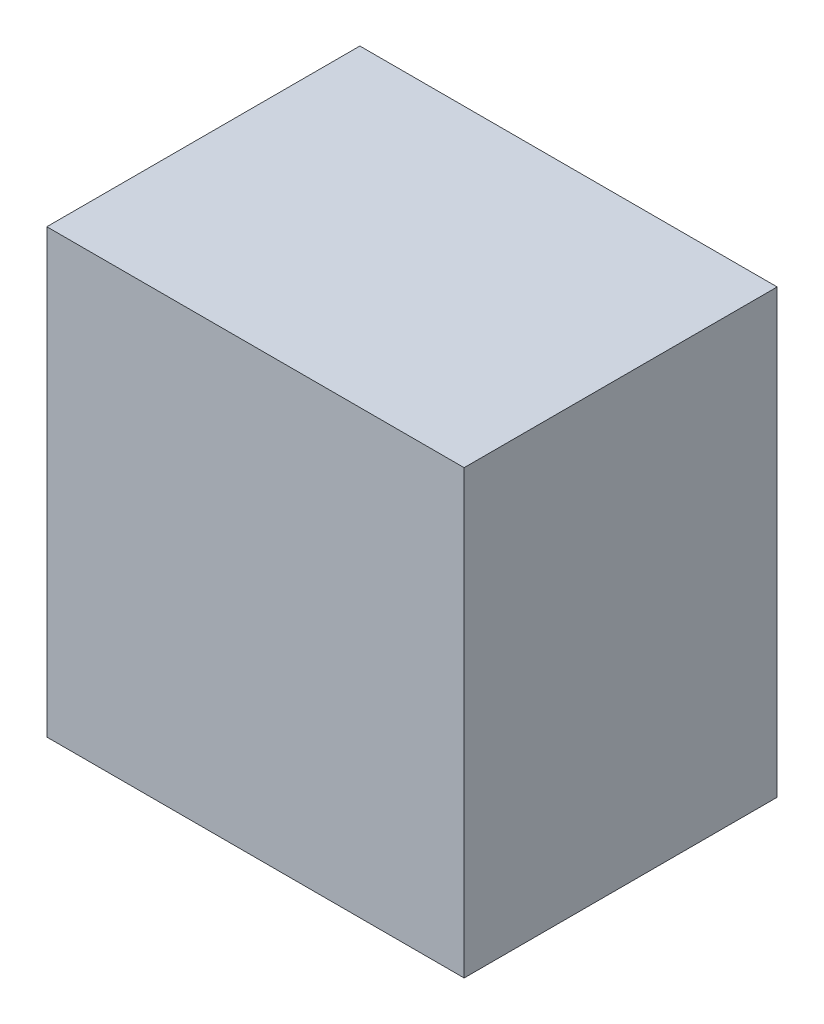
ISO-10303-21;
HEADER;
FILE_DESCRIPTION(('STEP AP214'),'2;1');
FILE_NAME('part.step','',(''),(''),'','','');
FILE_SCHEMA(('AUTOMOTIVE_DESIGN { 1 0 10303 214 1 1 1 1 }'));
ENDSEC;
DATA;
#1=APPLICATION_CONTEXT('core data for automotive mechanical design processes');
#2=APPLICATION_PROTOCOL_DEFINITION('international standard','automotive_design',2000,#1);
#3=PRODUCT_CONTEXT('',#1,'mechanical');
#4=PRODUCT('Part','Part','',(#3));
#5=PRODUCT_RELATED_PRODUCT_CATEGORY('part','',(#4));
#6=PRODUCT_DEFINITION_FORMATION('','',#4);
#7=PRODUCT_DEFINITION_CONTEXT('part definition',#1,'design');
#8=PRODUCT_DEFINITION('design','',#6,#7);
#9=PRODUCT_DEFINITION_SHAPE('','',#8);
#10=(LENGTH_UNIT() NAMED_UNIT(*) SI_UNIT(.MILLI.,.METRE.));
#11=(NAMED_UNIT(*) PLANE_ANGLE_UNIT() SI_UNIT($,.RADIAN.));
#12=(NAMED_UNIT(*) SI_UNIT($,.STERADIAN.) SOLID_ANGLE_UNIT());
#13=UNCERTAINTY_MEASURE_WITH_UNIT(LENGTH_MEASURE(1.E-05),#10,'distance_accuracy_value','');
#14=(GEOMETRIC_REPRESENTATION_CONTEXT(3) GLOBAL_UNCERTAINTY_ASSIGNED_CONTEXT((#13)) GLOBAL_UNIT_ASSIGNED_CONTEXT((#10,
#11,#12)) REPRESENTATION_CONTEXT('',''));
#15=CARTESIAN_POINT('',(0.,0.,0.));
#16=DIRECTION('',(0.,0.,1.));
#17=DIRECTION('',(1.,0.,0.));
#18=AXIS2_PLACEMENT_3D('',#15,#16,#17);
#19=CARTESIAN_POINT('',(3.29949302,3.4944939,4.95000026));
#20=DIRECTION('',(0.,0.,1.));
#21=DIRECTION('',(1.,0.,0.));
#22=AXIS2_PLACEMENT_3D('',#19,#20,#21);
#23=PLANE('',#22);
#24=DIRECTION('',(1.,0.,0.));
#25=VECTOR('',#24,1.);
#26=CARTESIAN_POINT('',(3.29949302,-3.49449136,4.95000026));
#27=LINE('',#26,#25);
#28=CARTESIAN_POINT('',(3.29949302,-3.49449136,4.95000026));
#29=VERTEX_POINT('',#28);
#30=CARTESIAN_POINT('',(-3.29949302,-3.49449136,4.95000026));
#31=VERTEX_POINT('',#30);
#32=EDGE_CURVE('E52',#29,#31,#27,.F.);
#33=ORIENTED_EDGE('',*,*,#32,.F.);
#34=DIRECTION('',(0.,1.,0.));
#35=VECTOR('',#34,1.);
#36=CARTESIAN_POINT('',(3.29949302,3.4944939,4.95000026));
#37=LINE('',#36,#35);
#38=CARTESIAN_POINT('',(3.29949302,3.4944939,4.95000026));
#39=VERTEX_POINT('',#38);
#40=EDGE_CURVE('E67',#39,#29,#37,.F.);
#41=ORIENTED_EDGE('',*,*,#40,.F.);
#42=DIRECTION('',(1.,0.,0.));
#43=VECTOR('',#42,1.);
#44=CARTESIAN_POINT('',(-3.29949302,3.4944939,4.95000026));
#45=LINE('',#44,#43);
#46=CARTESIAN_POINT('',(-3.29949302,3.4944939,4.95000026));
#47=VERTEX_POINT('',#46);
#48=EDGE_CURVE('E19',#47,#39,#45,.T.);
#49=ORIENTED_EDGE('',*,*,#48,.F.);
#50=DIRECTION('',(0.,1.,0.));
#51=VECTOR('',#50,1.);
#52=CARTESIAN_POINT('',(-3.29949302,-3.49449136,4.95000026));
#53=LINE('',#52,#51);
#54=EDGE_CURVE('E57',#31,#47,#53,.T.);
#55=ORIENTED_EDGE('',*,*,#54,.F.);
#56=EDGE_LOOP('',(#33,#41,#49,#55));
#57=FACE_BOUND('',#56,.T.);
#58=ADVANCED_FACE('F16',(#57),#23,.T.);
#59=CARTESIAN_POINT('',(-3.29949302,3.4944939,0.));
#60=DIRECTION('',(0.,1.,0.));
#61=DIRECTION('',(0.,0.,1.));
#62=AXIS2_PLACEMENT_3D('',#59,#60,#61);
#63=PLANE('',#62);
#64=DIRECTION('',(0.,0.,-1.));
#65=VECTOR('',#64,1.);
#66=CARTESIAN_POINT('',(3.29949302,3.4944939,0.));
#67=LINE('',#66,#65);
#68=CARTESIAN_POINT('',(3.29949302,3.4944939,0.));
#69=VERTEX_POINT('',#68);
#70=EDGE_CURVE('E78',#69,#39,#67,.F.);
#71=ORIENTED_EDGE('',*,*,#70,.F.);
#72=DIRECTION('',(1.,0.,0.));
#73=VECTOR('',#72,1.);
#74=CARTESIAN_POINT('',(3.29949302,3.4944939,0.));
#75=LINE('',#74,#73);
#76=CARTESIAN_POINT('',(-3.29949302,3.4944939,0.));
#77=VERTEX_POINT('',#76);
#78=EDGE_CURVE('E73',#69,#77,#75,.F.);
#79=ORIENTED_EDGE('',*,*,#78,.T.);
#80=DIRECTION('',(0.,0.,1.));
#81=VECTOR('',#80,1.);
#82=CARTESIAN_POINT('',(-3.29949302,3.4944939,0.));
#83=LINE('',#82,#81);
#84=EDGE_CURVE('E62',#47,#77,#83,.F.);
#85=ORIENTED_EDGE('',*,*,#84,.F.);
#86=ORIENTED_EDGE('',*,*,#48,.T.);
#87=EDGE_LOOP('',(#71,#79,#85,#86));
#88=FACE_BOUND('',#87,.T.);
#89=ADVANCED_FACE('F72',(#88),#63,.T.);
#90=CARTESIAN_POINT('',(-3.29949302,-3.49449136,0.));
#91=DIRECTION('',(-1.,0.,0.));
#92=DIRECTION('',(0.,0.,1.));
#93=AXIS2_PLACEMENT_3D('',#90,#91,#92);
#94=PLANE('',#93);
#95=ORIENTED_EDGE('',*,*,#84,.T.);
#96=DIRECTION('',(0.,1.,0.));
#97=VECTOR('',#96,1.);
#98=CARTESIAN_POINT('',(-3.29949302,3.4944939,0.));
#99=LINE('',#98,#97);
#100=CARTESIAN_POINT('',(-3.29949302,-3.49449136,0.));
#101=VERTEX_POINT('',#100);
#102=EDGE_CURVE('E83',#77,#101,#99,.F.);
#103=ORIENTED_EDGE('',*,*,#102,.T.);
#104=DIRECTION('',(0.,0.,-1.));
#105=VECTOR('',#104,1.);
#106=CARTESIAN_POINT('',(-3.29949302,-3.49449136,0.));
#107=LINE('',#106,#105);
#108=EDGE_CURVE('E64',#31,#101,#107,.T.);
#109=ORIENTED_EDGE('',*,*,#108,.F.);
#110=ORIENTED_EDGE('',*,*,#54,.T.);
#111=EDGE_LOOP('',(#95,#103,#109,#110));
#112=FACE_BOUND('',#111,.T.);
#113=ADVANCED_FACE('F59',(#112),#94,.T.);
#114=CARTESIAN_POINT('',(3.29949302,-3.49449136,0.));
#115=DIRECTION('',(0.,-1.,0.));
#116=DIRECTION('',(0.,0.,-1.));
#117=AXIS2_PLACEMENT_3D('',#114,#115,#116);
#118=PLANE('',#117);
#119=ORIENTED_EDGE('',*,*,#108,.T.);
#120=DIRECTION('',(1.,0.,0.));
#121=VECTOR('',#120,1.);
#122=CARTESIAN_POINT('',(3.29949302,-3.49449136,0.));
#123=LINE('',#122,#121);
#124=CARTESIAN_POINT('',(3.29949302,-3.49449136,0.));
#125=VERTEX_POINT('',#124);
#126=EDGE_CURVE('E25',#101,#125,#123,.T.);
#127=ORIENTED_EDGE('',*,*,#126,.T.);
#128=DIRECTION('',(0.,0.,-1.));
#129=VECTOR('',#128,1.);
#130=CARTESIAN_POINT('',(3.29949302,-3.49449136,0.));
#131=LINE('',#130,#129);
#132=EDGE_CURVE('E33',#29,#125,#131,.T.);
#133=ORIENTED_EDGE('',*,*,#132,.F.);
#134=ORIENTED_EDGE('',*,*,#32,.T.);
#135=EDGE_LOOP('',(#119,#127,#133,#134));
#136=FACE_BOUND('',#135,.T.);
#137=ADVANCED_FACE('F87',(#136),#118,.T.);
#138=CARTESIAN_POINT('',(3.29949302,3.4944939,0.));
#139=DIRECTION('',(1.,0.,0.));
#140=DIRECTION('',(0.,0.,-1.));
#141=AXIS2_PLACEMENT_3D('',#138,#139,#140);
#142=PLANE('',#141);
#143=ORIENTED_EDGE('',*,*,#132,.T.);
#144=DIRECTION('',(0.,1.,0.));
#145=VECTOR('',#144,1.);
#146=CARTESIAN_POINT('',(3.29949302,3.4944939,0.));
#147=LINE('',#146,#145);
#148=EDGE_CURVE('E11',#125,#69,#147,.T.);
#149=ORIENTED_EDGE('',*,*,#148,.T.);
#150=ORIENTED_EDGE('',*,*,#70,.T.);
#151=ORIENTED_EDGE('',*,*,#40,.T.);
#152=EDGE_LOOP('',(#143,#149,#150,#151));
#153=FACE_BOUND('',#152,.T.);
#154=ADVANCED_FACE('F90',(#153),#142,.T.);
#155=CARTESIAN_POINT('',(3.29949302,3.4944939,0.));
#156=DIRECTION('',(0.,0.,1.));
#157=DIRECTION('',(1.,0.,0.));
#158=AXIS2_PLACEMENT_3D('',#155,#156,#157);
#159=PLANE('',#158);
#160=ORIENTED_EDGE('',*,*,#126,.F.);
#161=ORIENTED_EDGE('',*,*,#102,.F.);
#162=ORIENTED_EDGE('',*,*,#78,.F.);
#163=ORIENTED_EDGE('',*,*,#148,.F.);
#164=EDGE_LOOP('',(#160,#161,#162,#163));
#165=FACE_BOUND('',#164,.T.);
#166=ADVANCED_FACE('F89',(#165),#159,.F.);
#167=CLOSED_SHELL('',(#58,#89,#113,#137,#154,#166));
#168=MANIFOLD_SOLID_BREP('B1',#167);
#169=ADVANCED_BREP_SHAPE_REPRESENTATION('',(#18,#168),#14);
#170=SHAPE_DEFINITION_REPRESENTATION(#9,#169);
ENDSEC;
END-ISO-10303-21;
